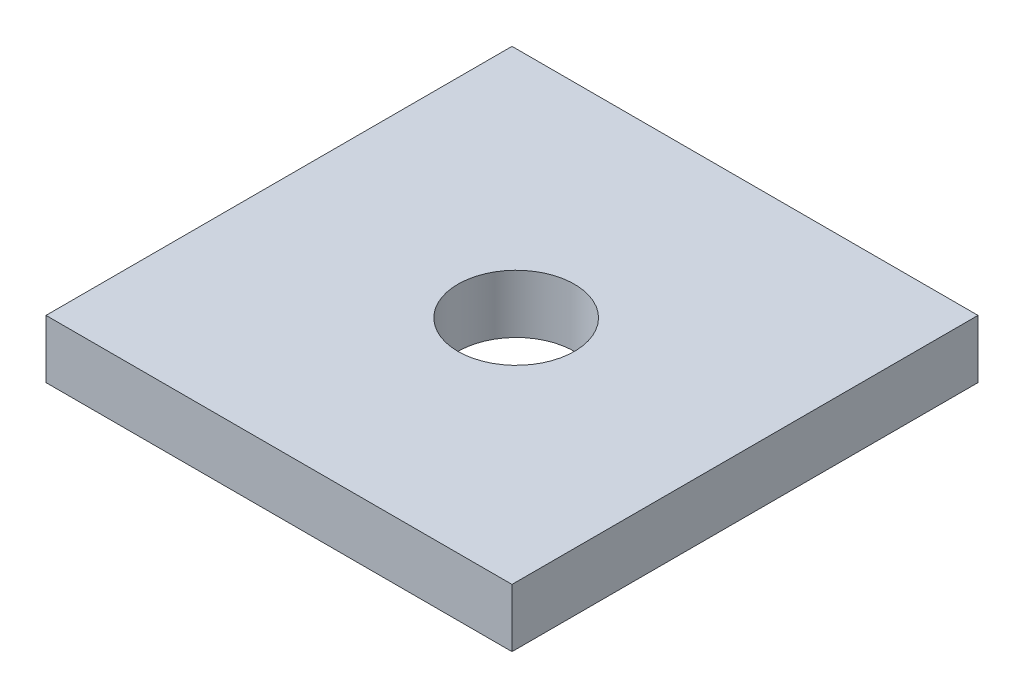
ISO-10303-21;
HEADER;
FILE_DESCRIPTION(('STEP AP214'),'2;1');
FILE_NAME('part.step','',(''),(''),'','','');
FILE_SCHEMA(('AUTOMOTIVE_DESIGN { 1 0 10303 214 1 1 1 1 }'));
ENDSEC;
DATA;
#1=APPLICATION_CONTEXT('core data for automotive mechanical design processes');
#2=APPLICATION_PROTOCOL_DEFINITION('international standard','automotive_design',2000,#1);
#3=PRODUCT_CONTEXT('',#1,'mechanical');
#4=PRODUCT('Part','Part','',(#3));
#5=PRODUCT_RELATED_PRODUCT_CATEGORY('part','',(#4));
#6=PRODUCT_DEFINITION_FORMATION('','',#4);
#7=PRODUCT_DEFINITION_CONTEXT('part definition',#1,'design');
#8=PRODUCT_DEFINITION('design','',#6,#7);
#9=PRODUCT_DEFINITION_SHAPE('','',#8);
#10=(LENGTH_UNIT() NAMED_UNIT(*) SI_UNIT(.MILLI.,.METRE.));
#11=(NAMED_UNIT(*) PLANE_ANGLE_UNIT() SI_UNIT($,.RADIAN.));
#12=(NAMED_UNIT(*) SI_UNIT($,.STERADIAN.) SOLID_ANGLE_UNIT());
#13=UNCERTAINTY_MEASURE_WITH_UNIT(LENGTH_MEASURE(1.E-05),#10,'distance_accuracy_value','');
#14=(GEOMETRIC_REPRESENTATION_CONTEXT(3) GLOBAL_UNCERTAINTY_ASSIGNED_CONTEXT((#13)) GLOBAL_UNIT_ASSIGNED_CONTEXT((#10,
#11,#12)) REPRESENTATION_CONTEXT('',''));
#15=CARTESIAN_POINT('',(0.,0.,0.));
#16=DIRECTION('',(0.,0.,1.));
#17=DIRECTION('',(1.,0.,0.));
#18=AXIS2_PLACEMENT_3D('',#15,#16,#17);
#19=CARTESIAN_POINT('',(0.,3.175,0.));
#20=DIRECTION('',(1.,0.,0.));
#21=DIRECTION('',(0.,0.,-1.));
#22=AXIS2_PLACEMENT_3D('',#19,#20,#21);
#23=PLANE('',#22);
#24=DIRECTION('',(0.,0.,1.));
#25=VECTOR('',#24,1.);
#26=CARTESIAN_POINT('',(0.,0.,0.));
#27=LINE('',#26,#25);
#28=CARTESIAN_POINT('',(0.,0.,-25.4));
#29=VERTEX_POINT('',#28);
#30=CARTESIAN_POINT('',(0.,0.,0.));
#31=VERTEX_POINT('',#30);
#32=EDGE_CURVE('E100',#29,#31,#27,.T.);
#33=ORIENTED_EDGE('',*,*,#32,.T.);
#34=DIRECTION('',(0.,-1.,0.));
#35=VECTOR('',#34,1.);
#36=CARTESIAN_POINT('',(0.,3.175,0.));
#37=LINE('',#36,#35);
#38=CARTESIAN_POINT('',(0.,3.175,0.));
#39=VERTEX_POINT('',#38);
#40=EDGE_CURVE('E11',#39,#31,#37,.T.);
#41=ORIENTED_EDGE('',*,*,#40,.F.);
#42=DIRECTION('',(0.,0.,1.));
#43=VECTOR('',#42,1.);
#44=CARTESIAN_POINT('',(0.,3.175,0.));
#45=LINE('',#44,#43);
#46=CARTESIAN_POINT('',(0.,3.175,-25.4));
#47=VERTEX_POINT('',#46);
#48=EDGE_CURVE('E88',#47,#39,#45,.T.);
#49=ORIENTED_EDGE('',*,*,#48,.F.);
#50=DIRECTION('',(0.,-1.,0.));
#51=VECTOR('',#50,1.);
#52=CARTESIAN_POINT('',(0.,3.175,-25.4));
#53=LINE('',#52,#51);
#54=EDGE_CURVE('E96',#47,#29,#53,.T.);
#55=ORIENTED_EDGE('',*,*,#54,.T.);
#56=EDGE_LOOP('',(#33,#41,#49,#55));
#57=FACE_BOUND('',#56,.T.);
#58=ADVANCED_FACE('F37',(#57),#23,.F.);
#59=CARTESIAN_POINT('',(0.,3.175,0.));
#60=DIRECTION('',(0.,0.,-1.));
#61=DIRECTION('',(-1.,0.,0.));
#62=AXIS2_PLACEMENT_3D('',#59,#60,#61);
#63=PLANE('',#62);
#64=DIRECTION('',(1.,0.,0.));
#65=VECTOR('',#64,1.);
#66=CARTESIAN_POINT('',(0.,0.,0.));
#67=LINE('',#66,#65);
#68=CARTESIAN_POINT('',(25.4,0.,0.));
#69=VERTEX_POINT('',#68);
#70=EDGE_CURVE('E92',#31,#69,#67,.T.);
#71=ORIENTED_EDGE('',*,*,#70,.T.);
#72=DIRECTION('',(0.,-1.,0.));
#73=VECTOR('',#72,1.);
#74=CARTESIAN_POINT('',(25.4,3.175,0.));
#75=LINE('',#74,#73);
#76=CARTESIAN_POINT('',(25.4,3.175,0.));
#77=VERTEX_POINT('',#76);
#78=EDGE_CURVE('E45',#77,#69,#75,.T.);
#79=ORIENTED_EDGE('',*,*,#78,.F.);
#80=DIRECTION('',(1.,0.,0.));
#81=VECTOR('',#80,1.);
#82=CARTESIAN_POINT('',(0.,3.175,0.));
#83=LINE('',#82,#81);
#84=EDGE_CURVE('E83',#39,#77,#83,.T.);
#85=ORIENTED_EDGE('',*,*,#84,.F.);
#86=ORIENTED_EDGE('',*,*,#40,.T.);
#87=EDGE_LOOP('',(#71,#79,#85,#86));
#88=FACE_BOUND('',#87,.T.);
#89=ADVANCED_FACE('F91',(#88),#63,.F.);
#90=CARTESIAN_POINT('',(25.4,3.175,0.));
#91=DIRECTION('',(-1.,0.,0.));
#92=DIRECTION('',(0.,0.,1.));
#93=AXIS2_PLACEMENT_3D('',#90,#91,#92);
#94=PLANE('',#93);
#95=DIRECTION('',(0.,0.,-1.));
#96=VECTOR('',#95,1.);
#97=CARTESIAN_POINT('',(25.4,0.,0.));
#98=LINE('',#97,#96);
#99=CARTESIAN_POINT('',(25.4,0.,-25.4));
#100=VERTEX_POINT('',#99);
#101=EDGE_CURVE('E70',#69,#100,#98,.T.);
#102=ORIENTED_EDGE('',*,*,#101,.T.);
#103=DIRECTION('',(0.,-1.,0.));
#104=VECTOR('',#103,1.);
#105=CARTESIAN_POINT('',(25.4,3.175,-25.4));
#106=LINE('',#105,#104);
#107=CARTESIAN_POINT('',(25.4,3.175,-25.4));
#108=VERTEX_POINT('',#107);
#109=EDGE_CURVE('E93',#108,#100,#106,.T.);
#110=ORIENTED_EDGE('',*,*,#109,.F.);
#111=DIRECTION('',(0.,0.,-1.));
#112=VECTOR('',#111,1.);
#113=CARTESIAN_POINT('',(25.4,3.175,0.));
#114=LINE('',#113,#112);
#115=EDGE_CURVE('E86',#77,#108,#114,.T.);
#116=ORIENTED_EDGE('',*,*,#115,.F.);
#117=ORIENTED_EDGE('',*,*,#78,.T.);
#118=EDGE_LOOP('',(#102,#110,#116,#117));
#119=FACE_BOUND('',#118,.T.);
#120=ADVANCED_FACE('F94',(#119),#94,.F.);
#121=CARTESIAN_POINT('',(0.,3.175,-25.4));
#122=DIRECTION('',(0.,0.,1.));
#123=DIRECTION('',(1.,0.,0.));
#124=AXIS2_PLACEMENT_3D('',#121,#122,#123);
#125=PLANE('',#124);
#126=DIRECTION('',(-1.,0.,0.));
#127=VECTOR('',#126,1.);
#128=CARTESIAN_POINT('',(0.,0.,-25.4));
#129=LINE('',#128,#127);
#130=EDGE_CURVE('E76',#100,#29,#129,.T.);
#131=ORIENTED_EDGE('',*,*,#130,.T.);
#132=ORIENTED_EDGE('',*,*,#54,.F.);
#133=DIRECTION('',(-1.,0.,0.));
#134=VECTOR('',#133,1.);
#135=CARTESIAN_POINT('',(0.,3.175,-25.4));
#136=LINE('',#135,#134);
#137=EDGE_CURVE('E53',#108,#47,#136,.T.);
#138=ORIENTED_EDGE('',*,*,#137,.F.);
#139=ORIENTED_EDGE('',*,*,#109,.T.);
#140=EDGE_LOOP('',(#131,#132,#138,#139));
#141=FACE_BOUND('',#140,.T.);
#142=ADVANCED_FACE('F108',(#141),#125,.F.);
#143=CARTESIAN_POINT('',(0.,3.175,0.));
#144=DIRECTION('',(0.,-1.,0.));
#145=DIRECTION('',(0.,0.,-1.));
#146=AXIS2_PLACEMENT_3D('',#143,#144,#145);
#147=PLANE('',#146);
#148=CARTESIAN_POINT('',(12.9275837973995,3.175,-12.7));
#149=DIRECTION('',(0.,1.,0.));
#150=DIRECTION('',(0.,0.,1.));
#151=AXIS2_PLACEMENT_3D('',#148,#149,#150);
#152=CIRCLE('',#151,3.175);
#153=CARTESIAN_POINT('',(12.9275837973995,3.175,-9.525));
#154=VERTEX_POINT('',#153);
#155=EDGE_CURVE('E114',#154,#154,#152,.T.);
#156=ORIENTED_EDGE('',*,*,#155,.F.);
#157=EDGE_LOOP('',(#156));
#158=FACE_BOUND('',#157,.T.);
#159=ORIENTED_EDGE('',*,*,#48,.T.);
#160=ORIENTED_EDGE('',*,*,#84,.T.);
#161=ORIENTED_EDGE('',*,*,#115,.T.);
#162=ORIENTED_EDGE('',*,*,#137,.T.);
#163=EDGE_LOOP('',(#159,#160,#161,#162));
#164=FACE_BOUND('',#163,.T.);
#165=ADVANCED_FACE('F84',(#158,#164),#147,.F.);
#166=CARTESIAN_POINT('',(0.,0.,0.));
#167=DIRECTION('',(0.,-1.,0.));
#168=DIRECTION('',(0.,0.,-1.));
#169=AXIS2_PLACEMENT_3D('',#166,#167,#168);
#170=PLANE('',#169);
#171=CARTESIAN_POINT('',(12.9275837973995,0.,-12.7));
#172=DIRECTION('',(0.,1.,0.));
#173=DIRECTION('',(0.,0.,1.));
#174=AXIS2_PLACEMENT_3D('',#171,#172,#173);
#175=CIRCLE('',#174,3.175);
#176=CARTESIAN_POINT('',(12.9275837973995,0.,-9.525));
#177=VERTEX_POINT('',#176);
#178=EDGE_CURVE('E103',#177,#177,#175,.T.);
#179=ORIENTED_EDGE('',*,*,#178,.T.);
#180=EDGE_LOOP('',(#179));
#181=FACE_BOUND('',#180,.T.);
#182=ORIENTED_EDGE('',*,*,#32,.F.);
#183=ORIENTED_EDGE('',*,*,#130,.F.);
#184=ORIENTED_EDGE('',*,*,#101,.F.);
#185=ORIENTED_EDGE('',*,*,#70,.F.);
#186=EDGE_LOOP('',(#182,#183,#184,#185));
#187=FACE_BOUND('',#186,.T.);
#188=ADVANCED_FACE('F111',(#181,#187),#170,.T.);
#189=CARTESIAN_POINT('',(12.9275837973995,0.,-12.7));
#190=DIRECTION('',(0.,1.,0.));
#191=DIRECTION('',(0.,0.,1.));
#192=AXIS2_PLACEMENT_3D('',#189,#190,#191);
#193=CYLINDRICAL_SURFACE('',#192,3.175);
#194=ORIENTED_EDGE('',*,*,#178,.F.);
#195=EDGE_LOOP('',(#194));
#196=FACE_BOUND('',#195,.T.);
#197=ORIENTED_EDGE('',*,*,#155,.T.);
#198=EDGE_LOOP('',(#197));
#199=FACE_BOUND('',#198,.T.);
#200=ADVANCED_FACE('F121',(#196,#199),#193,.F.);
#201=CLOSED_SHELL('',(#58,#89,#120,#142,#165,#188,#200));
#202=MANIFOLD_SOLID_BREP('B2',#201);
#203=ADVANCED_BREP_SHAPE_REPRESENTATION('',(#18,#202),#14);
#204=SHAPE_DEFINITION_REPRESENTATION(#9,#203);
ENDSEC;
END-ISO-10303-21;
